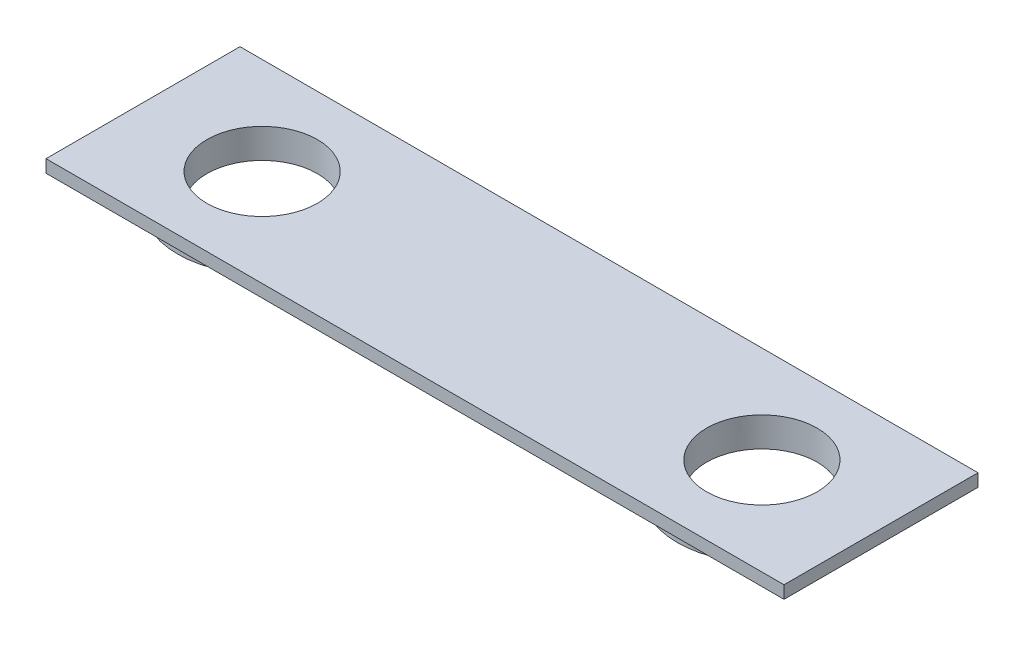
ISO-10303-21;
HEADER;
FILE_DESCRIPTION(('STEP AP214'),'2;1');
FILE_NAME('part.step','',(''),(''),'','','');
FILE_SCHEMA(('AUTOMOTIVE_DESIGN { 1 0 10303 214 1 1 1 1 }'));
ENDSEC;
DATA;
#1=APPLICATION_CONTEXT('core data for automotive mechanical design processes');
#2=APPLICATION_PROTOCOL_DEFINITION('international standard','automotive_design',2000,#1);
#3=PRODUCT_CONTEXT('',#1,'mechanical');
#4=PRODUCT('Part','Part','',(#3));
#5=PRODUCT_RELATED_PRODUCT_CATEGORY('part','',(#4));
#6=PRODUCT_DEFINITION_FORMATION('','',#4);
#7=PRODUCT_DEFINITION_CONTEXT('part definition',#1,'design');
#8=PRODUCT_DEFINITION('design','',#6,#7);
#9=PRODUCT_DEFINITION_SHAPE('','',#8);
#10=(LENGTH_UNIT() NAMED_UNIT(*) SI_UNIT(.MILLI.,.METRE.));
#11=(NAMED_UNIT(*) PLANE_ANGLE_UNIT() SI_UNIT($,.RADIAN.));
#12=(NAMED_UNIT(*) SI_UNIT($,.STERADIAN.) SOLID_ANGLE_UNIT());
#13=UNCERTAINTY_MEASURE_WITH_UNIT(LENGTH_MEASURE(1.E-05),#10,'distance_accuracy_value','');
#14=(GEOMETRIC_REPRESENTATION_CONTEXT(3) GLOBAL_UNCERTAINTY_ASSIGNED_CONTEXT((#13)) GLOBAL_UNIT_ASSIGNED_CONTEXT((#10,
#11,#12)) REPRESENTATION_CONTEXT('',''));
#15=CARTESIAN_POINT('',(0.,0.,0.));
#16=DIRECTION('',(0.,0.,1.));
#17=DIRECTION('',(1.,0.,0.));
#18=AXIS2_PLACEMENT_3D('',#15,#16,#17);
#19=CARTESIAN_POINT('',(0.,0.,0.));
#20=DIRECTION('',(0.,1.,0.));
#21=DIRECTION('',(0.,0.,1.));
#22=AXIS2_PLACEMENT_3D('',#19,#20,#21);
#23=PLANE('',#22);
#24=CARTESIAN_POINT('',(-29.625,0.,0.));
#25=DIRECTION('',(0.,1.,0.));
#26=DIRECTION('',(0.,0.,1.));
#27=AXIS2_PLACEMENT_3D('',#24,#25,#26);
#28=CIRCLE('',#27,9.99999999999999);
#29=CARTESIAN_POINT('',(-29.625,0.,9.99999999999999));
#30=VERTEX_POINT('',#29);
#31=EDGE_CURVE('E52',#30,#30,#28,.F.);
#32=ORIENTED_EDGE('',*,*,#31,.F.);
#33=EDGE_LOOP('',(#32));
#34=FACE_BOUND('',#33,.T.);
#35=DIRECTION('',(0.,0.,-1.));
#36=VECTOR('',#35,1.);
#37=CARTESIAN_POINT('',(43.75,0.,-11.5));
#38=LINE('',#37,#36);
#39=CARTESIAN_POINT('',(43.75,0.,11.5));
#40=VERTEX_POINT('',#39);
#41=CARTESIAN_POINT('',(43.75,0.,-11.5));
#42=VERTEX_POINT('',#41);
#43=EDGE_CURVE('E112',#40,#42,#38,.T.);
#44=ORIENTED_EDGE('',*,*,#43,.F.);
#45=DIRECTION('',(1.,0.,0.));
#46=VECTOR('',#45,1.);
#47=CARTESIAN_POINT('',(-43.75,0.,11.5));
#48=LINE('',#47,#46);
#49=CARTESIAN_POINT('',(-43.75,0.,11.5));
#50=VERTEX_POINT('',#49);
#51=EDGE_CURVE('E83',#50,#40,#48,.T.);
#52=ORIENTED_EDGE('',*,*,#51,.F.);
#53=DIRECTION('',(0.,0.,1.));
#54=VECTOR('',#53,1.);
#55=CARTESIAN_POINT('',(-43.75,0.,-11.5));
#56=LINE('',#55,#54);
#57=CARTESIAN_POINT('',(-43.75,0.,-11.5));
#58=VERTEX_POINT('',#57);
#59=EDGE_CURVE('E77',#58,#50,#56,.T.);
#60=ORIENTED_EDGE('',*,*,#59,.F.);
#61=DIRECTION('',(-1.,0.,0.));
#62=VECTOR('',#61,1.);
#63=CARTESIAN_POINT('',(-43.75,0.,-11.5));
#64=LINE('',#63,#62);
#65=EDGE_CURVE('E102',#42,#58,#64,.T.);
#66=ORIENTED_EDGE('',*,*,#65,.F.);
#67=EDGE_LOOP('',(#44,#52,#60,#66));
#68=FACE_BOUND('',#67,.T.);
#69=CARTESIAN_POINT('',(29.625,0.,0.));
#70=DIRECTION('',(0.,1.,0.));
#71=DIRECTION('',(0.,0.,1.));
#72=AXIS2_PLACEMENT_3D('',#69,#70,#71);
#73=CIRCLE('',#72,9.99999999999999);
#74=CARTESIAN_POINT('',(29.625,0.,9.99999999999999));
#75=VERTEX_POINT('',#74);
#76=EDGE_CURVE('E11',#75,#75,#73,.F.);
#77=ORIENTED_EDGE('',*,*,#76,.F.);
#78=EDGE_LOOP('',(#77));
#79=FACE_BOUND('',#78,.T.);
#80=ADVANCED_FACE('F43',(#34,#68,#79),#23,.F.);
#81=CARTESIAN_POINT('',(0.,1.5,0.));
#82=DIRECTION('',(0.,1.,0.));
#83=DIRECTION('',(0.,0.,1.));
#84=AXIS2_PLACEMENT_3D('',#81,#82,#83);
#85=PLANE('',#84);
#86=CARTESIAN_POINT('',(-29.625,1.5,0.));
#87=DIRECTION('',(0.,1.,0.));
#88=DIRECTION('',(0.,0.,1.));
#89=AXIS2_PLACEMENT_3D('',#86,#87,#88);
#90=CIRCLE('',#89,6.55);
#91=CARTESIAN_POINT('',(-29.625,1.5,6.55));
#92=VERTEX_POINT('',#91);
#93=EDGE_CURVE('E115',#92,#92,#90,.T.);
#94=ORIENTED_EDGE('',*,*,#93,.F.);
#95=EDGE_LOOP('',(#94));
#96=FACE_BOUND('',#95,.T.);
#97=DIRECTION('',(0.,0.,-1.));
#98=VECTOR('',#97,1.);
#99=CARTESIAN_POINT('',(43.75,1.5,-11.5));
#100=LINE('',#99,#98);
#101=CARTESIAN_POINT('',(43.75,1.5,11.5));
#102=VERTEX_POINT('',#101);
#103=CARTESIAN_POINT('',(43.75,1.5,-11.5));
#104=VERTEX_POINT('',#103);
#105=EDGE_CURVE('E97',#102,#104,#100,.T.);
#106=ORIENTED_EDGE('',*,*,#105,.T.);
#107=DIRECTION('',(-1.,0.,0.));
#108=VECTOR('',#107,1.);
#109=CARTESIAN_POINT('',(-43.75,1.5,-11.5));
#110=LINE('',#109,#108);
#111=CARTESIAN_POINT('',(-43.75,1.5,-11.5));
#112=VERTEX_POINT('',#111);
#113=EDGE_CURVE('E91',#104,#112,#110,.T.);
#114=ORIENTED_EDGE('',*,*,#113,.T.);
#115=DIRECTION('',(0.,0.,1.));
#116=VECTOR('',#115,1.);
#117=CARTESIAN_POINT('',(-43.75,1.5,-11.5));
#118=LINE('',#117,#116);
#119=CARTESIAN_POINT('',(-43.75,1.5,11.5));
#120=VERTEX_POINT('',#119);
#121=EDGE_CURVE('E95',#112,#120,#118,.T.);
#122=ORIENTED_EDGE('',*,*,#121,.T.);
#123=DIRECTION('',(1.,0.,0.));
#124=VECTOR('',#123,1.);
#125=CARTESIAN_POINT('',(-43.75,1.5,11.5));
#126=LINE('',#125,#124);
#127=EDGE_CURVE('E60',#120,#102,#126,.T.);
#128=ORIENTED_EDGE('',*,*,#127,.T.);
#129=EDGE_LOOP('',(#106,#114,#122,#128));
#130=FACE_BOUND('',#129,.T.);
#131=CARTESIAN_POINT('',(29.625,1.5,0.));
#132=DIRECTION('',(0.,1.,0.));
#133=DIRECTION('',(0.,0.,1.));
#134=AXIS2_PLACEMENT_3D('',#131,#132,#133);
#135=CIRCLE('',#134,6.54999999999999);
#136=CARTESIAN_POINT('',(29.625,1.5,6.54999999999999));
#137=VERTEX_POINT('',#136);
#138=EDGE_CURVE('E177',#137,#137,#135,.T.);
#139=ORIENTED_EDGE('',*,*,#138,.F.);
#140=EDGE_LOOP('',(#139));
#141=FACE_BOUND('',#140,.T.);
#142=ADVANCED_FACE('F92',(#96,#130,#141),#85,.T.);
#143=CARTESIAN_POINT('',(43.75,1.5,-11.5));
#144=DIRECTION('',(-1.,0.,0.));
#145=DIRECTION('',(0.,0.,1.));
#146=AXIS2_PLACEMENT_3D('',#143,#144,#145);
#147=PLANE('',#146);
#148=ORIENTED_EDGE('',*,*,#43,.T.);
#149=DIRECTION('',(0.,-1.,0.));
#150=VECTOR('',#149,1.);
#151=CARTESIAN_POINT('',(43.75,1.5,-11.5));
#152=LINE('',#151,#150);
#153=EDGE_CURVE('E103',#104,#42,#152,.T.);
#154=ORIENTED_EDGE('',*,*,#153,.F.);
#155=ORIENTED_EDGE('',*,*,#105,.F.);
#156=DIRECTION('',(0.,-1.,0.));
#157=VECTOR('',#156,1.);
#158=CARTESIAN_POINT('',(43.75,1.5,11.5));
#159=LINE('',#158,#157);
#160=EDGE_CURVE('E108',#102,#40,#159,.T.);
#161=ORIENTED_EDGE('',*,*,#160,.T.);
#162=EDGE_LOOP('',(#148,#154,#155,#161));
#163=FACE_BOUND('',#162,.T.);
#164=ADVANCED_FACE('F45',(#163),#147,.F.);
#165=CARTESIAN_POINT('',(-43.75,1.5,-11.5));
#166=DIRECTION('',(0.,0.,1.));
#167=DIRECTION('',(1.,0.,0.));
#168=AXIS2_PLACEMENT_3D('',#165,#166,#167);
#169=PLANE('',#168);
#170=ORIENTED_EDGE('',*,*,#65,.T.);
#171=DIRECTION('',(0.,-1.,0.));
#172=VECTOR('',#171,1.);
#173=CARTESIAN_POINT('',(-43.75,1.5,-11.5));
#174=LINE('',#173,#172);
#175=EDGE_CURVE('E100',#112,#58,#174,.T.);
#176=ORIENTED_EDGE('',*,*,#175,.F.);
#177=ORIENTED_EDGE('',*,*,#113,.F.);
#178=ORIENTED_EDGE('',*,*,#153,.T.);
#179=EDGE_LOOP('',(#170,#176,#177,#178));
#180=FACE_BOUND('',#179,.T.);
#181=ADVANCED_FACE('F101',(#180),#169,.F.);
#182=CARTESIAN_POINT('',(-43.75,1.5,-11.5));
#183=DIRECTION('',(1.,0.,0.));
#184=DIRECTION('',(0.,0.,-1.));
#185=AXIS2_PLACEMENT_3D('',#182,#183,#184);
#186=PLANE('',#185);
#187=ORIENTED_EDGE('',*,*,#59,.T.);
#188=DIRECTION('',(0.,-1.,0.));
#189=VECTOR('',#188,1.);
#190=CARTESIAN_POINT('',(-43.75,1.5,11.5));
#191=LINE('',#190,#189);
#192=EDGE_CURVE('E104',#120,#50,#191,.T.);
#193=ORIENTED_EDGE('',*,*,#192,.F.);
#194=ORIENTED_EDGE('',*,*,#121,.F.);
#195=ORIENTED_EDGE('',*,*,#175,.T.);
#196=EDGE_LOOP('',(#187,#193,#194,#195));
#197=FACE_BOUND('',#196,.T.);
#198=ADVANCED_FACE('F106',(#197),#186,.F.);
#199=CARTESIAN_POINT('',(-43.75,1.5,11.5));
#200=DIRECTION('',(0.,0.,-1.));
#201=DIRECTION('',(-1.,0.,0.));
#202=AXIS2_PLACEMENT_3D('',#199,#200,#201);
#203=PLANE('',#202);
#204=ORIENTED_EDGE('',*,*,#51,.T.);
#205=ORIENTED_EDGE('',*,*,#160,.F.);
#206=ORIENTED_EDGE('',*,*,#127,.F.);
#207=ORIENTED_EDGE('',*,*,#192,.T.);
#208=EDGE_LOOP('',(#204,#205,#206,#207));
#209=FACE_BOUND('',#208,.T.);
#210=ADVANCED_FACE('F159',(#209),#203,.F.);
#211=CARTESIAN_POINT('',(-29.625,1.5,0.));
#212=DIRECTION('',(0.,-1.,0.));
#213=DIRECTION('',(0.,0.,-1.));
#214=AXIS2_PLACEMENT_3D('',#211,#212,#213);
#215=CYLINDRICAL_SURFACE('',#214,6.55);
#216=ORIENTED_EDGE('',*,*,#93,.T.);
#217=EDGE_LOOP('',(#216));
#218=FACE_BOUND('',#217,.T.);
#219=CARTESIAN_POINT('',(-29.625,-2.,0.));
#220=DIRECTION('',(0.,-1.,0.));
#221=DIRECTION('',(0.,0.,-1.));
#222=AXIS2_PLACEMENT_3D('',#219,#220,#221);
#223=CIRCLE('',#222,6.55);
#224=CARTESIAN_POINT('',(-29.625,-2.,-6.55));
#225=VERTEX_POINT('',#224);
#226=EDGE_CURVE('E183',#225,#225,#223,.T.);
#227=ORIENTED_EDGE('',*,*,#226,.T.);
#228=EDGE_LOOP('',(#227));
#229=FACE_BOUND('',#228,.T.);
#230=ADVANCED_FACE('F155',(#218,#229),#215,.F.);
#231=CARTESIAN_POINT('',(29.625,1.5,0.));
#232=DIRECTION('',(0.,-1.,0.));
#233=DIRECTION('',(0.,0.,-1.));
#234=AXIS2_PLACEMENT_3D('',#231,#232,#233);
#235=CYLINDRICAL_SURFACE('',#234,6.54999999999999);
#236=ORIENTED_EDGE('',*,*,#138,.T.);
#237=EDGE_LOOP('',(#236));
#238=FACE_BOUND('',#237,.T.);
#239=CARTESIAN_POINT('',(29.625,-2.,0.));
#240=DIRECTION('',(0.,-1.,0.));
#241=DIRECTION('',(0.,0.,-1.));
#242=AXIS2_PLACEMENT_3D('',#239,#240,#241);
#243=CIRCLE('',#242,6.55);
#244=CARTESIAN_POINT('',(29.625,-2.,-6.55));
#245=VERTEX_POINT('',#244);
#246=EDGE_CURVE('E186',#245,#245,#243,.T.);
#247=ORIENTED_EDGE('',*,*,#246,.T.);
#248=EDGE_LOOP('',(#247));
#249=FACE_BOUND('',#248,.T.);
#250=ADVANCED_FACE('F148',(#238,#249),#235,.F.);
#251=CARTESIAN_POINT('',(-29.625,-2.,0.));
#252=DIRECTION('',(0.,-1.,0.));
#253=DIRECTION('',(0.,0.,-1.));
#254=AXIS2_PLACEMENT_3D('',#251,#252,#253);
#255=PLANE('',#254);
#256=CARTESIAN_POINT('',(-29.625,-2.,0.));
#257=DIRECTION('',(0.,-1.,0.));
#258=DIRECTION('',(0.,0.,-1.));
#259=AXIS2_PLACEMENT_3D('',#256,#257,#258);
#260=CIRCLE('',#259,9.99999999999999);
#261=CARTESIAN_POINT('',(-29.625,-2.,-9.99999999999999));
#262=VERTEX_POINT('',#261);
#263=EDGE_CURVE('E180',#262,#262,#260,.T.);
#264=ORIENTED_EDGE('',*,*,#263,.T.);
#265=EDGE_LOOP('',(#264));
#266=FACE_BOUND('',#265,.T.);
#267=ORIENTED_EDGE('',*,*,#226,.F.);
#268=EDGE_LOOP('',(#267));
#269=FACE_BOUND('',#268,.T.);
#270=ADVANCED_FACE('F145',(#266,#269),#255,.T.);
#271=CARTESIAN_POINT('',(-29.625,-2.,0.));
#272=DIRECTION('',(0.,1.,0.));
#273=DIRECTION('',(0.,0.,1.));
#274=AXIS2_PLACEMENT_3D('',#271,#272,#273);
#275=CYLINDRICAL_SURFACE('',#274,9.99999999999999);
#276=ORIENTED_EDGE('',*,*,#263,.F.);
#277=EDGE_LOOP('',(#276));
#278=FACE_BOUND('',#277,.T.);
#279=ORIENTED_EDGE('',*,*,#31,.T.);
#280=EDGE_LOOP('',(#279));
#281=FACE_BOUND('',#280,.T.);
#282=ADVANCED_FACE('F124',(#278,#281),#275,.T.);
#283=CARTESIAN_POINT('',(29.625,-2.,0.));
#284=DIRECTION('',(0.,-1.,0.));
#285=DIRECTION('',(0.,0.,-1.));
#286=AXIS2_PLACEMENT_3D('',#283,#284,#285);
#287=PLANE('',#286);
#288=CARTESIAN_POINT('',(29.625,-2.,0.));
#289=DIRECTION('',(0.,-1.,0.));
#290=DIRECTION('',(0.,0.,-1.));
#291=AXIS2_PLACEMENT_3D('',#288,#289,#290);
#292=CIRCLE('',#291,9.99999999999999);
#293=CARTESIAN_POINT('',(29.625,-2.,-9.99999999999999));
#294=VERTEX_POINT('',#293);
#295=EDGE_CURVE('E189',#294,#294,#292,.T.);
#296=ORIENTED_EDGE('',*,*,#295,.T.);
#297=EDGE_LOOP('',(#296));
#298=FACE_BOUND('',#297,.T.);
#299=ORIENTED_EDGE('',*,*,#246,.F.);
#300=EDGE_LOOP('',(#299));
#301=FACE_BOUND('',#300,.T.);
#302=ADVANCED_FACE('F135',(#298,#301),#287,.T.);
#303=CARTESIAN_POINT('',(29.625,-2.,0.));
#304=DIRECTION('',(0.,1.,0.));
#305=DIRECTION('',(0.,0.,1.));
#306=AXIS2_PLACEMENT_3D('',#303,#304,#305);
#307=CYLINDRICAL_SURFACE('',#306,9.99999999999999);
#308=ORIENTED_EDGE('',*,*,#295,.F.);
#309=EDGE_LOOP('',(#308));
#310=FACE_BOUND('',#309,.T.);
#311=ORIENTED_EDGE('',*,*,#76,.T.);
#312=EDGE_LOOP('',(#311));
#313=FACE_BOUND('',#312,.T.);
#314=ADVANCED_FACE('F133',(#310,#313),#307,.T.);
#315=CLOSED_SHELL('',(#80,#142,#164,#181,#198,#210,#230,#250,#270,#282,#302,#314));
#316=MANIFOLD_SOLID_BREP('B2',#315);
#317=ADVANCED_BREP_SHAPE_REPRESENTATION('',(#18,#316),#14);
#318=SHAPE_DEFINITION_REPRESENTATION(#9,#317);
ENDSEC;
END-ISO-10303-21;
